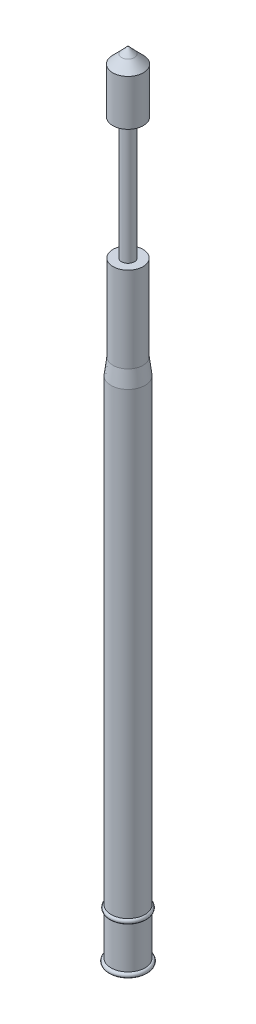
ISO-10303-21;
HEADER;
FILE_DESCRIPTION(('STEP AP214'),'2;1');
FILE_NAME('part.step','',(''),(''),'','','');
FILE_SCHEMA(('AUTOMOTIVE_DESIGN { 1 0 10303 214 1 1 1 1 }'));
ENDSEC;
DATA;
#1=APPLICATION_CONTEXT('core data for automotive mechanical design processes');
#2=APPLICATION_PROTOCOL_DEFINITION('international standard','automotive_design',2000,#1);
#3=PRODUCT_CONTEXT('',#1,'mechanical');
#4=PRODUCT('Part','Part','',(#3));
#5=PRODUCT_RELATED_PRODUCT_CATEGORY('part','',(#4));
#6=PRODUCT_DEFINITION_FORMATION('','',#4);
#7=PRODUCT_DEFINITION_CONTEXT('part definition',#1,'design');
#8=PRODUCT_DEFINITION('design','',#6,#7);
#9=PRODUCT_DEFINITION_SHAPE('','',#8);
#10=(LENGTH_UNIT() NAMED_UNIT(*) SI_UNIT(.MILLI.,.METRE.));
#11=(NAMED_UNIT(*) PLANE_ANGLE_UNIT() SI_UNIT($,.RADIAN.));
#12=(NAMED_UNIT(*) SI_UNIT($,.STERADIAN.) SOLID_ANGLE_UNIT());
#13=UNCERTAINTY_MEASURE_WITH_UNIT(LENGTH_MEASURE(1.E-05),#10,'distance_accuracy_value','');
#14=(GEOMETRIC_REPRESENTATION_CONTEXT(3) GLOBAL_UNCERTAINTY_ASSIGNED_CONTEXT((#13)) GLOBAL_UNIT_ASSIGNED_CONTEXT((#10,
#11,#12)) REPRESENTATION_CONTEXT('',''));
#15=CARTESIAN_POINT('',(0.,0.,0.));
#16=DIRECTION('',(0.,0.,1.));
#17=DIRECTION('',(1.,0.,0.));
#18=AXIS2_PLACEMENT_3D('',#15,#16,#17);
#19=CARTESIAN_POINT('',(0.,39.,0.));
#20=DIRECTION('',(0.,-1.,0.));
#21=DIRECTION('',(0.,0.,-1.));
#22=AXIS2_PLACEMENT_3D('',#19,#20,#21);
#23=CYLINDRICAL_SURFACE('',#22,0.32);
#24=CARTESIAN_POINT('',(0.,36.,0.));
#25=DIRECTION('',(0.,-1.,0.));
#26=DIRECTION('',(1.,0.,0.));
#27=AXIS2_PLACEMENT_3D('',#24,#25,#26);
#28=CIRCLE('',#27,0.32);
#29=CARTESIAN_POINT('',(0.32,36.,0.));
#30=VERTEX_POINT('',#29);
#31=EDGE_CURVE('E55',#30,#30,#28,.T.);
#32=ORIENTED_EDGE('',*,*,#31,.T.);
#33=EDGE_LOOP('',(#32));
#34=FACE_BOUND('',#33,.T.);
#35=CARTESIAN_POINT('',(0.,30.,0.));
#36=DIRECTION('',(0.,1.,0.));
#37=DIRECTION('',(0.,0.,1.));
#38=AXIS2_PLACEMENT_3D('',#35,#36,#37);
#39=CIRCLE('',#38,0.32);
#40=CARTESIAN_POINT('',(0.,30.,0.32));
#41=VERTEX_POINT('',#40);
#42=EDGE_CURVE('E11',#41,#41,#39,.T.);
#43=ORIENTED_EDGE('',*,*,#42,.T.);
#44=EDGE_LOOP('',(#43));
#45=FACE_BOUND('',#44,.T.);
#46=ADVANCED_FACE('F51',(#34,#45),#23,.T.);
#47=CARTESIAN_POINT('',(0.,30.,0.));
#48=DIRECTION('',(0.,-1.,0.));
#49=DIRECTION('',(0.,0.,-1.));
#50=AXIS2_PLACEMENT_3D('',#47,#48,#49);
#51=CYLINDRICAL_SURFACE('',#50,0.735);
#52=CARTESIAN_POINT('',(0.,25.8,0.));
#53=DIRECTION('',(0.,-1.,0.));
#54=DIRECTION('',(0.,0.,-1.));
#55=AXIS2_PLACEMENT_3D('',#52,#53,#54);
#56=CIRCLE('',#55,0.735);
#57=CARTESIAN_POINT('',(0.,25.8,-0.735));
#58=VERTEX_POINT('',#57);
#59=EDGE_CURVE('E88',#58,#58,#56,.T.);
#60=ORIENTED_EDGE('',*,*,#59,.F.);
#61=EDGE_LOOP('',(#60));
#62=FACE_BOUND('',#61,.T.);
#63=CARTESIAN_POINT('',(0.,30.,0.));
#64=DIRECTION('',(0.,1.,0.));
#65=DIRECTION('',(0.,0.,1.));
#66=AXIS2_PLACEMENT_3D('',#63,#64,#65);
#67=CIRCLE('',#66,0.735);
#68=CARTESIAN_POINT('',(0.,30.,0.735));
#69=VERTEX_POINT('',#68);
#70=EDGE_CURVE('E92',#69,#69,#67,.T.);
#71=ORIENTED_EDGE('',*,*,#70,.F.);
#72=EDGE_LOOP('',(#71));
#73=FACE_BOUND('',#72,.T.);
#74=ADVANCED_FACE('F133',(#62,#73),#51,.T.);
#75=CARTESIAN_POINT('',(0.,30.,0.));
#76=DIRECTION('',(0.,1.,0.));
#77=DIRECTION('',(0.,0.,1.));
#78=AXIS2_PLACEMENT_3D('',#75,#76,#77);
#79=PLANE('',#78);
#80=ORIENTED_EDGE('',*,*,#42,.F.);
#81=EDGE_LOOP('',(#80));
#82=FACE_BOUND('',#81,.T.);
#83=ORIENTED_EDGE('',*,*,#70,.T.);
#84=EDGE_LOOP('',(#83));
#85=FACE_BOUND('',#84,.T.);
#86=ADVANCED_FACE('F139',(#82,#85),#79,.T.);
#87=CARTESIAN_POINT('',(0.,25.,0.));
#88=DIRECTION('',(0.,-1.,0.));
#89=DIRECTION('',(0.,0.,-1.));
#90=AXIS2_PLACEMENT_3D('',#87,#88,#89);
#91=CONICAL_SURFACE('',#90,0.835,0.124354994546762);
#92=ORIENTED_EDGE('',*,*,#59,.T.);
#93=EDGE_LOOP('',(#92));
#94=FACE_BOUND('',#93,.T.);
#95=CARTESIAN_POINT('',(0.,25.,0.));
#96=DIRECTION('',(0.,1.,0.));
#97=DIRECTION('',(0.,0.,1.));
#98=AXIS2_PLACEMENT_3D('',#95,#96,#97);
#99=CIRCLE('',#98,0.835);
#100=CARTESIAN_POINT('',(0.,25.,0.835));
#101=VERTEX_POINT('',#100);
#102=EDGE_CURVE('E60',#101,#101,#99,.T.);
#103=ORIENTED_EDGE('',*,*,#102,.T.);
#104=EDGE_LOOP('',(#103));
#105=FACE_BOUND('',#104,.T.);
#106=ADVANCED_FACE('F145',(#94,#105),#91,.T.);
#107=CARTESIAN_POINT('',(0.,25.,0.));
#108=DIRECTION('',(0.,-1.,0.));
#109=DIRECTION('',(0.,0.,-1.));
#110=AXIS2_PLACEMENT_3D('',#107,#108,#109);
#111=CYLINDRICAL_SURFACE('',#110,0.835);
#112=CARTESIAN_POINT('',(0.,2.5,0.));
#113=DIRECTION('',(0.,-1.,0.));
#114=DIRECTION('',(0.,0.,-1.));
#115=AXIS2_PLACEMENT_3D('',#112,#113,#114);
#116=CIRCLE('',#115,0.835);
#117=CARTESIAN_POINT('',(0.,2.5,-0.835));
#118=VERTEX_POINT('',#117);
#119=EDGE_CURVE('E98',#118,#118,#116,.T.);
#120=ORIENTED_EDGE('',*,*,#119,.F.);
#121=EDGE_LOOP('',(#120));
#122=FACE_BOUND('',#121,.T.);
#123=ORIENTED_EDGE('',*,*,#102,.F.);
#124=EDGE_LOOP('',(#123));
#125=FACE_BOUND('',#124,.T.);
#126=ADVANCED_FACE('F53',(#122,#125),#111,.T.);
#127=CARTESIAN_POINT('',(0.,2.385,0.));
#128=DIRECTION('',(0.,-1.,0.));
#129=DIRECTION('',(0.,0.,-1.));
#130=AXIS2_PLACEMENT_3D('',#127,#128,#129);
#131=TOROIDAL_SURFACE('',#130,0.79234375,0.12265625);
#132=ORIENTED_EDGE('',*,*,#119,.T.);
#133=EDGE_LOOP('',(#132));
#134=FACE_BOUND('',#133,.T.);
#135=CARTESIAN_POINT('',(0.,2.27,0.));
#136=DIRECTION('',(0.,-1.,0.));
#137=DIRECTION('',(0.,0.,-1.));
#138=AXIS2_PLACEMENT_3D('',#135,#136,#137);
#139=CIRCLE('',#138,0.835);
#140=CARTESIAN_POINT('',(0.,2.27,-0.835));
#141=VERTEX_POINT('',#140);
#142=EDGE_CURVE('E97',#141,#141,#139,.T.);
#143=ORIENTED_EDGE('',*,*,#142,.F.);
#144=EDGE_LOOP('',(#143));
#145=FACE_BOUND('',#144,.T.);
#146=ADVANCED_FACE('F159',(#134,#145),#131,.T.);
#147=CARTESIAN_POINT('',(0.,0.23,0.));
#148=DIRECTION('',(0.,-1.,0.));
#149=DIRECTION('',(0.,0.,-1.));
#150=AXIS2_PLACEMENT_3D('',#147,#148,#149);
#151=CIRCLE('',#150,0.835);
#152=CARTESIAN_POINT('',(0.,0.23,-0.835));
#153=VERTEX_POINT('',#152);
#154=EDGE_CURVE('E93',#153,#153,#151,.T.);
#155=ORIENTED_EDGE('',*,*,#154,.F.);
#156=EDGE_LOOP('',(#155));
#157=FACE_BOUND('',#156,.T.);
#158=ORIENTED_EDGE('',*,*,#142,.T.);
#159=EDGE_LOOP('',(#158));
#160=FACE_BOUND('',#159,.T.);
#161=ADVANCED_FACE('F128',(#157,#160),#111,.T.);
#162=CARTESIAN_POINT('',(0.,0.115,0.));
#163=DIRECTION('',(0.,-1.,0.));
#164=DIRECTION('',(0.,0.,-1.));
#165=AXIS2_PLACEMENT_3D('',#162,#163,#164);
#166=TOROIDAL_SURFACE('',#165,0.835,0.115);
#167=ORIENTED_EDGE('',*,*,#154,.T.);
#168=EDGE_LOOP('',(#167));
#169=FACE_BOUND('',#168,.T.);
#170=CARTESIAN_POINT('',(0.,0.,0.));
#171=DIRECTION('',(0.,1.,0.));
#172=DIRECTION('',(0.,0.,1.));
#173=AXIS2_PLACEMENT_3D('',#170,#171,#172);
#174=CIRCLE('',#173,0.835);
#175=CARTESIAN_POINT('',(0.,0.,0.835));
#176=VERTEX_POINT('',#175);
#177=EDGE_CURVE('E108',#176,#176,#174,.T.);
#178=ORIENTED_EDGE('',*,*,#177,.T.);
#179=EDGE_LOOP('',(#178));
#180=FACE_BOUND('',#179,.T.);
#181=ADVANCED_FACE('F115',(#169,#180),#166,.T.);
#182=CARTESIAN_POINT('',(0.,0.,0.));
#183=DIRECTION('',(0.,1.,0.));
#184=DIRECTION('',(0.,0.,1.));
#185=AXIS2_PLACEMENT_3D('',#182,#183,#184);
#186=PLANE('',#185);
#187=ORIENTED_EDGE('',*,*,#177,.F.);
#188=EDGE_LOOP('',(#187));
#189=FACE_BOUND('',#188,.T.);
#190=ADVANCED_FACE('F117',(#189),#186,.F.);
#191=CARTESIAN_POINT('',(0.,39.,0.));
#192=DIRECTION('',(0.,-1.,0.));
#193=DIRECTION('',(1.,0.,0.));
#194=AXIS2_PLACEMENT_3D('',#191,#192,#193);
#195=CONICAL_SURFACE('',#194,0.,0.785398163397444);
#196=CARTESIAN_POINT('',(0.,38.25,0.));
#197=DIRECTION('',(0.,1.,0.));
#198=DIRECTION('',(-1.,0.,0.));
#199=AXIS2_PLACEMENT_3D('',#196,#197,#198);
#200=CIRCLE('',#199,0.75);
#201=CARTESIAN_POINT('',(-0.750000000000005,38.25,0.));
#202=VERTEX_POINT('',#201);
#203=EDGE_CURVE('E74',#202,#202,#200,.T.);
#204=ORIENTED_EDGE('',*,*,#203,.T.);
#205=EDGE_LOOP('',(#204));
#206=FACE_BOUND('',#205,.T.);
#207=CARTESIAN_POINT('',(0.,38.68,0.));
#208=DIRECTION('',(0.,1.,0.));
#209=DIRECTION('',(-1.,0.,0.));
#210=AXIS2_PLACEMENT_3D('',#207,#208,#209);
#211=CIRCLE('',#210,0.320000000000006);
#212=CARTESIAN_POINT('',(0.319999999999997,38.68,0.));
#213=VERTEX_POINT('',#212);
#214=EDGE_CURVE('E75',#213,#213,#211,.T.);
#215=ORIENTED_EDGE('',*,*,#214,.F.);
#216=EDGE_LOOP('',(#215));
#217=FACE_BOUND('',#216,.T.);
#218=ADVANCED_FACE('F119',(#206,#217),#195,.T.);
#219=CARTESIAN_POINT('',(-0.750000000000004,36.,0.));
#220=DIRECTION('',(0.,-1.,0.));
#221=DIRECTION('',(1.,0.,0.));
#222=AXIS2_PLACEMENT_3D('',#219,#220,#221);
#223=PLANE('',#222);
#224=ORIENTED_EDGE('',*,*,#31,.F.);
#225=EDGE_LOOP('',(#224));
#226=FACE_BOUND('',#225,.T.);
#227=CARTESIAN_POINT('',(0.,36.,0.));
#228=DIRECTION('',(0.,1.,0.));
#229=DIRECTION('',(-1.,0.,0.));
#230=AXIS2_PLACEMENT_3D('',#227,#228,#229);
#231=CIRCLE('',#230,0.75);
#232=CARTESIAN_POINT('',(-0.750000000000004,36.,0.));
#233=VERTEX_POINT('',#232);
#234=EDGE_CURVE('E80',#233,#233,#231,.T.);
#235=ORIENTED_EDGE('',*,*,#234,.F.);
#236=EDGE_LOOP('',(#235));
#237=FACE_BOUND('',#236,.T.);
#238=ADVANCED_FACE('F124',(#226,#237),#223,.T.);
#239=CARTESIAN_POINT('',(0.,0.,0.));
#240=DIRECTION('',(0.,1.,0.));
#241=DIRECTION('',(-1.,0.,0.));
#242=AXIS2_PLACEMENT_3D('',#239,#240,#241);
#243=CYLINDRICAL_SURFACE('',#242,0.75);
#244=ORIENTED_EDGE('',*,*,#234,.T.);
#245=EDGE_LOOP('',(#244));
#246=FACE_BOUND('',#245,.T.);
#247=ORIENTED_EDGE('',*,*,#203,.F.);
#248=EDGE_LOOP('',(#247));
#249=FACE_BOUND('',#248,.T.);
#250=ADVANCED_FACE('F208',(#246,#249),#243,.T.);
#251=CARTESIAN_POINT('',(0.,39.,0.));
#252=DIRECTION('',(0.,-1.,0.));
#253=DIRECTION('',(1.,0.,0.));
#254=AXIS2_PLACEMENT_3D('',#251,#252,#253);
#255=CONICAL_SURFACE('',#254,0.0200000000000055,0.753151280962193);
#256=CARTESIAN_POINT('',(0.,39.,0.));
#257=DIRECTION('',(0.,1.,0.));
#258=DIRECTION('',(-1.,0.,0.));
#259=AXIS2_PLACEMENT_3D('',#256,#257,#258);
#260=CIRCLE('',#259,0.0200000000000055);
#261=CARTESIAN_POINT('',(0.0199999999999968,39.,0.));
#262=VERTEX_POINT('',#261);
#263=EDGE_CURVE('E71',#262,#262,#260,.T.);
#264=CARTESIAN_POINT('',(0.319999999999997,38.68,0.));
#265=CARTESIAN_POINT('',(0.316874999999995,38.6833333333333,0.));
#266=CARTESIAN_POINT('',(0.313749999999996,38.6866666666667,0.));
#267=CARTESIAN_POINT('',(0.307499999999997,38.6933333333333,0.));
#268=CARTESIAN_POINT('',(0.304374999999998,38.6966666666667,0.));
#269=CARTESIAN_POINT('',(0.298124999999997,38.7033333333333,0.));
#270=CARTESIAN_POINT('',(0.294999999999996,38.7066666666667,0.));
#271=CARTESIAN_POINT('',(0.288749999999996,38.7133333333333,0.));
#272=CARTESIAN_POINT('',(0.285624999999997,38.7166666666667,0.));
#273=CARTESIAN_POINT('',(0.279374999999997,38.7233333333333,0.));
#274=CARTESIAN_POINT('',(0.276249999999996,38.7266666666667,0.));
#275=CARTESIAN_POINT('',(0.269999999999996,38.7333333333333,0.));
#276=CARTESIAN_POINT('',(0.266874999999997,38.7366666666667,0.));
#277=CARTESIAN_POINT('',(0.260624999999997,38.7433333333333,0.));
#278=CARTESIAN_POINT('',(0.257499999999997,38.7466666666667,0.));
#279=CARTESIAN_POINT('',(0.251249999999996,38.7533333333333,0.));
#280=CARTESIAN_POINT('',(0.248124999999996,38.7566666666667,0.));
#281=CARTESIAN_POINT('',(0.241874999999997,38.7633333333333,0.));
#282=CARTESIAN_POINT('',(0.238749999999998,38.7666666666667,0.));
#283=CARTESIAN_POINT('',(0.232499999999997,38.7733333333333,0.));
#284=CARTESIAN_POINT('',(0.229374999999996,38.7766666666667,0.));
#285=CARTESIAN_POINT('',(0.223124999999996,38.7833333333333,0.));
#286=CARTESIAN_POINT('',(0.219999999999997,38.7866666666667,0.));
#287=CARTESIAN_POINT('',(0.213749999999997,38.7933333333333,0.));
#288=CARTESIAN_POINT('',(0.210624999999996,38.7966666666667,0.));
#289=CARTESIAN_POINT('',(0.204374999999996,38.8033333333333,0.));
#290=CARTESIAN_POINT('',(0.201249999999997,38.8066666666667,0.));
#291=CARTESIAN_POINT('',(0.194999999999997,38.8133333333333,0.));
#292=CARTESIAN_POINT('',(0.191874999999996,38.8166666666667,0.));
#293=CARTESIAN_POINT('',(0.185624999999996,38.8233333333333,0.));
#294=CARTESIAN_POINT('',(0.182499999999997,38.8266666666667,0.));
#295=CARTESIAN_POINT('',(0.176249999999997,38.8333333333333,0.));
#296=CARTESIAN_POINT('',(0.173124999999997,38.8366666666667,0.));
#297=CARTESIAN_POINT('',(0.166874999999996,38.8433333333333,0.));
#298=CARTESIAN_POINT('',(0.163749999999996,38.8466666666667,0.));
#299=CARTESIAN_POINT('',(0.157499999999997,38.8533333333333,0.));
#300=CARTESIAN_POINT('',(0.154374999999998,38.8566666666667,0.));
#301=CARTESIAN_POINT('',(0.148124999999997,38.8633333333333,0.));
#302=CARTESIAN_POINT('',(0.144999999999996,38.8666666666667,0.));
#303=CARTESIAN_POINT('',(0.138749999999996,38.8733333333333,0.));
#304=CARTESIAN_POINT('',(0.135624999999997,38.8766666666667,0.));
#305=CARTESIAN_POINT('',(0.129374999999997,38.8833333333333,0.));
#306=CARTESIAN_POINT('',(0.126249999999996,38.8866666666667,0.));
#307=CARTESIAN_POINT('',(0.119999999999996,38.8933333333333,0.));
#308=CARTESIAN_POINT('',(0.116874999999997,38.8966666666667,0.));
#309=CARTESIAN_POINT('',(0.110624999999997,38.9033333333333,0.));
#310=CARTESIAN_POINT('',(0.107499999999997,38.9066666666667,0.));
#311=CARTESIAN_POINT('',(0.101249999999996,38.9133333333333,0.));
#312=CARTESIAN_POINT('',(0.0981249999999964,38.9166666666667,0.));
#313=CARTESIAN_POINT('',(0.0918749999999972,38.9233333333333,0.));
#314=CARTESIAN_POINT('',(0.0887499999999977,38.9266666666667,0.));
#315=CARTESIAN_POINT('',(0.0824999999999971,38.9333333333333,0.));
#316=CARTESIAN_POINT('',(0.0793749999999962,38.9366666666667,0.));
#317=CARTESIAN_POINT('',(0.0731249999999963,38.9433333333333,0.));
#318=CARTESIAN_POINT('',(0.0699999999999974,38.9466666666667,0.));
#319=CARTESIAN_POINT('',(0.0637499999999974,38.9533333333333,0.));
#320=CARTESIAN_POINT('',(0.0606249999999962,38.9566666666667,0.));
#321=CARTESIAN_POINT('',(0.0543749999999962,38.9633333333333,0.));
#322=CARTESIAN_POINT('',(0.0512499999999973,38.9666666666667,0.));
#323=CARTESIAN_POINT('',(0.0449999999999974,38.9733333333333,0.));
#324=CARTESIAN_POINT('',(0.0418749999999965,38.9766666666667,0.));
#325=CARTESIAN_POINT('',(0.035624999999996,38.9833333333333,0.));
#326=CARTESIAN_POINT('',(0.0324999999999964,38.9866666666667,0.));
#327=CARTESIAN_POINT('',(0.0262499999999972,38.9933333333333,0.));
#328=CARTESIAN_POINT('',(0.0231249999999976,38.9966666666667,0.));
#329=CARTESIAN_POINT('',(0.0199999999999968,39.,0.));
#330=B_SPLINE_CURVE_WITH_KNOTS('',3,(#264,#265,#266,#267,#268,#269,#270,#271,#272,#273,#274,
#275,#276,#277,#278,#279,#280,#281,#282,#283,#284,#285,#286,#287,#288,#289,#290,#291,#292,#293,
#294,#295,#296,#297,#298,#299,#300,#301,#302,#303,#304,#305,#306,#307,#308,#309,#310,#311,#312,
#313,#314,#315,#316,#317,#318,#319,#320,#321,#322,#323,#324,#325,#326,#327,#328,#329),
.UNSPECIFIED.,.F.,.F.,(4,2,2,2,2,2,2,2,2,2,2,2,2,2,2,2,2,2,2,2,2,2,2,2,2,2,2,2,2,2,2,2,4),(0.,
0.0137073201246605,0.0274146402493261,0.0411219603739866,0.0548292804986521,0.0685366006233126,
0.0822439207479781,0.0959512408726386,0.109658560997304,0.12336588112197,0.13707320124663,
0.150780521371296,0.164487841495956,0.178195161620622,0.191902481745282,0.205609801869948,
0.219317121994608,0.233024442119274,0.24673176224394,0.2604390823686,0.274146402493266,
0.287853722617926,0.301561042742592,0.315268362867252,0.328975682991918,0.342683003116583,
0.356390323241244,0.370097643365909,0.38380496349057,0.397512283615235,0.411219603739896,
0.424926923864561,0.438634243989227),.UNSPECIFIED.);
#331=EDGE_CURVE('BSEAM67',#213,#262,#330,.T.);
#332=ORIENTED_EDGE('',*,*,#214,.T.);
#333=ORIENTED_EDGE('',*,*,#263,.F.);
#334=ORIENTED_EDGE('',*,*,#331,.T.);
#335=ORIENTED_EDGE('',*,*,#331,.F.);
#336=EDGE_LOOP('',(#332,#334,#333,#335));
#337=FACE_BOUND('',#336,.T.);
#338=ADVANCED_FACE('F67',(#337),#255,.T.);
#339=CARTESIAN_POINT('',(0.,39.,0.));
#340=DIRECTION('',(0.,1.,0.));
#341=DIRECTION('',(0.,0.,1.));
#342=AXIS2_PLACEMENT_3D('',#339,#340,#341);
#343=PLANE('',#342);
#344=CARTESIAN_POINT('',(0.,39.,0.));
#345=VERTEX_POINT('',#344);
#346=VERTEX_LOOP('',#345);
#347=FACE_BOUND('',#346,.T.);
#348=ORIENTED_EDGE('',*,*,#263,.T.);
#349=EDGE_LOOP('',(#348));
#350=FACE_BOUND('',#349,.T.);
#351=ADVANCED_FACE('F64',(#347,#350),#343,.T.);
#352=CLOSED_SHELL('',(#46,#74,#86,#106,#126,#146,#161,#181,#190,#218,#238,#250,#338,#351));
#353=MANIFOLD_SOLID_BREP('B2',#352);
#354=ADVANCED_BREP_SHAPE_REPRESENTATION('',(#18,#353),#14);
#355=SHAPE_DEFINITION_REPRESENTATION(#9,#354);
ENDSEC;
END-ISO-10303-21;
